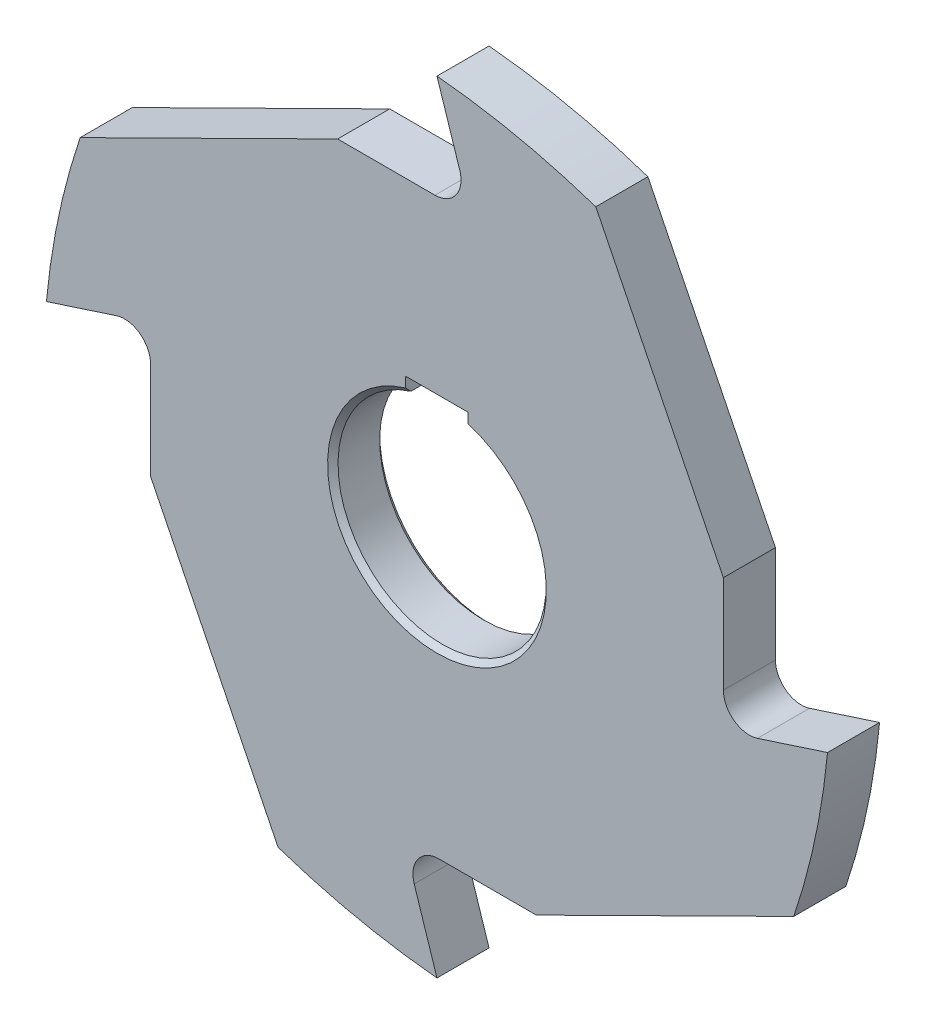
ISO-10303-21;
HEADER;
FILE_DESCRIPTION(('STEP AP214'),'2;1');
FILE_NAME('part.step','',(''),(''),'','','');
FILE_SCHEMA(('AUTOMOTIVE_DESIGN { 1 0 10303 214 1 1 1 1 }'));
ENDSEC;
DATA;
#1=APPLICATION_CONTEXT('core data for automotive mechanical design processes');
#2=APPLICATION_PROTOCOL_DEFINITION('international standard','automotive_design',2000,#1);
#3=PRODUCT_CONTEXT('',#1,'mechanical');
#4=PRODUCT('Part','Part','',(#3));
#5=PRODUCT_RELATED_PRODUCT_CATEGORY('part','',(#4));
#6=PRODUCT_DEFINITION_FORMATION('','',#4);
#7=PRODUCT_DEFINITION_CONTEXT('part definition',#1,'design');
#8=PRODUCT_DEFINITION('design','',#6,#7);
#9=PRODUCT_DEFINITION_SHAPE('','',#8);
#10=(LENGTH_UNIT() NAMED_UNIT(*) SI_UNIT(.MILLI.,.METRE.));
#11=(NAMED_UNIT(*) PLANE_ANGLE_UNIT() SI_UNIT($,.RADIAN.));
#12=(NAMED_UNIT(*) SI_UNIT($,.STERADIAN.) SOLID_ANGLE_UNIT());
#13=UNCERTAINTY_MEASURE_WITH_UNIT(LENGTH_MEASURE(1.E-05),#10,'distance_accuracy_value','');
#14=(GEOMETRIC_REPRESENTATION_CONTEXT(3) GLOBAL_UNCERTAINTY_ASSIGNED_CONTEXT((#13)) GLOBAL_UNIT_ASSIGNED_CONTEXT((#10,
#11,#12)) REPRESENTATION_CONTEXT('',''));
#15=CARTESIAN_POINT('',(0.,0.,0.));
#16=DIRECTION('',(0.,0.,1.));
#17=DIRECTION('',(1.,0.,0.));
#18=AXIS2_PLACEMENT_3D('',#15,#16,#17);
#19=CARTESIAN_POINT('',(0.,0.,-10.));
#20=DIRECTION('',(0.,0.,1.));
#21=DIRECTION('',(1.,0.,0.));
#22=AXIS2_PLACEMENT_3D('',#19,#20,#21);
#23=CYLINDRICAL_SURFACE('',#22,20.);
#24=DIRECTION('',(0.,0.,1.));
#25=VECTOR('',#24,1.);
#26=CARTESIAN_POINT('',(6.,19.0787840283389,-10.));
#27=LINE('',#26,#25);
#28=CARTESIAN_POINT('',(6.,19.0787840283389,-8.99999999999997));
#29=VERTEX_POINT('',#28);
#30=CARTESIAN_POINT('',(6.,19.0787840283389,-1.));
#31=VERTEX_POINT('',#30);
#32=EDGE_CURVE('E352',#29,#31,#27,.T.);
#33=ORIENTED_EDGE('',*,*,#32,.F.);
#34=CARTESIAN_POINT('',(0.,0.,-8.99999999999997));
#35=DIRECTION('',(0.,0.,1.));
#36=DIRECTION('',(1.,0.,0.));
#37=AXIS2_PLACEMENT_3D('',#34,#35,#36);
#38=CIRCLE('',#37,20.);
#39=CARTESIAN_POINT('',(-6.,19.0787840283389,-8.99999999999997));
#40=VERTEX_POINT('',#39);
#41=EDGE_CURVE('E530',#29,#40,#38,.F.);
#42=ORIENTED_EDGE('',*,*,#41,.T.);
#43=DIRECTION('',(0.,0.,1.));
#44=VECTOR('',#43,1.);
#45=CARTESIAN_POINT('',(-6.,19.0787840283389,-10.));
#46=LINE('',#45,#44);
#47=CARTESIAN_POINT('',(-6.,19.0787840283389,-1.));
#48=VERTEX_POINT('',#47);
#49=EDGE_CURVE('E362',#40,#48,#46,.T.);
#50=ORIENTED_EDGE('',*,*,#49,.T.);
#51=CARTESIAN_POINT('',(0.,0.,-1.));
#52=DIRECTION('',(0.,0.,1.));
#53=DIRECTION('',(1.,0.,0.));
#54=AXIS2_PLACEMENT_3D('',#51,#52,#53);
#55=CIRCLE('',#54,20.);
#56=EDGE_CURVE('E532',#48,#31,#55,.T.);
#57=ORIENTED_EDGE('',*,*,#56,.T.);
#58=EDGE_LOOP('',(#33,#42,#50,#57));
#59=FACE_BOUND('',#58,.T.);
#60=ADVANCED_FACE('F36',(#59),#23,.F.);
#61=CARTESIAN_POINT('',(6.,0.,-10.));
#62=DIRECTION('',(1.,0.,0.));
#63=DIRECTION('',(0.,0.,-1.));
#64=AXIS2_PLACEMENT_3D('',#61,#62,#63);
#65=PLANE('',#64);
#66=DIRECTION('',(0.,1.,0.));
#67=VECTOR('',#66,1.);
#68=CARTESIAN_POINT('',(6.,0.,-10.));
#69=LINE('',#68,#67);
#70=CARTESIAN_POINT('',(6.,20.1246117974981,-10.));
#71=VERTEX_POINT('',#70);
#72=CARTESIAN_POINT('',(6.,22.0787840283389,-10.));
#73=VERTEX_POINT('',#72);
#74=EDGE_CURVE('E221',#71,#73,#69,.T.);
#75=ORIENTED_EDGE('',*,*,#74,.F.);
#76=CARTESIAN_POINT('',(6.,20.1246117974981,-10.));
#77=CARTESIAN_POINT('',(6.,19.9504975400754,-9.83313424107121));
#78=CARTESIAN_POINT('',(6.,19.7762880979616,-9.66636802893565));
#79=CARTESIAN_POINT('',(6.,19.4276788415782,-9.33303469559913));
#80=CARTESIAN_POINT('',(6.,19.2532790273057,-9.16646757440136));
#81=CARTESIAN_POINT('',(6.,19.0787840283389,-8.99999999999997));
#82=B_SPLINE_CURVE_WITH_KNOTS('',3,(#76,#77,#78,#79,#80,#81),.UNSPECIFIED.,.F.,.F.,(4,2,4),(0.,
0.723490907396197,1.44698182630379),.UNSPECIFIED.);
#83=EDGE_CURVE('E408',#71,#29,#82,.T.);
#84=ORIENTED_EDGE('',*,*,#83,.T.);
#85=ORIENTED_EDGE('',*,*,#32,.T.);
#86=CARTESIAN_POINT('',(6.,19.0787840283389,-1.));
#87=CARTESIAN_POINT('',(6.,19.2532790273057,-0.83353242559862));
#88=CARTESIAN_POINT('',(6.,19.4276788415782,-0.666965304400848));
#89=CARTESIAN_POINT('',(6.,19.7762880979616,-0.333631971064345));
#90=CARTESIAN_POINT('',(6.,19.9504975400754,-0.166865758928783));
#91=CARTESIAN_POINT('',(6.,20.1246117974981,0.));
#92=B_SPLINE_CURVE_WITH_KNOTS('',3,(#86,#87,#88,#89,#90,#91),.UNSPECIFIED.,.F.,.F.,(4,2,4),(0.,
0.723490918907581,1.44698182630377),.UNSPECIFIED.);
#93=CARTESIAN_POINT('',(6.,20.1246117974981,0.));
#94=VERTEX_POINT('',#93);
#95=EDGE_CURVE('E402',#31,#94,#92,.T.);
#96=ORIENTED_EDGE('',*,*,#95,.T.);
#97=DIRECTION('',(0.,1.,0.));
#98=VECTOR('',#97,1.);
#99=CARTESIAN_POINT('',(6.,0.,0.));
#100=LINE('',#99,#98);
#101=CARTESIAN_POINT('',(6.,22.0787840283389,0.));
#102=VERTEX_POINT('',#101);
#103=EDGE_CURVE('E230',#94,#102,#100,.T.);
#104=ORIENTED_EDGE('',*,*,#103,.T.);
#105=DIRECTION('',(0.,0.,1.));
#106=VECTOR('',#105,1.);
#107=CARTESIAN_POINT('',(6.,22.0787840283389,-10.));
#108=LINE('',#107,#106);
#109=EDGE_CURVE('E356',#73,#102,#108,.T.);
#110=ORIENTED_EDGE('',*,*,#109,.F.);
#111=EDGE_LOOP('',(#75,#84,#85,#96,#104,#110));
#112=FACE_BOUND('',#111,.T.);
#113=ADVANCED_FACE('F413',(#112),#65,.F.);
#114=CARTESIAN_POINT('',(0.,22.0787840283389,-10.));
#115=DIRECTION('',(0.,-1.,0.));
#116=DIRECTION('',(0.,0.,-1.));
#117=AXIS2_PLACEMENT_3D('',#114,#115,#116);
#118=PLANE('',#117);
#119=DIRECTION('',(1.,0.,0.));
#120=VECTOR('',#119,1.);
#121=CARTESIAN_POINT('',(0.,22.0787840283389,0.));
#122=LINE('',#121,#120);
#123=CARTESIAN_POINT('',(-6.,22.0787840283389,0.));
#124=VERTEX_POINT('',#123);
#125=EDGE_CURVE('E348',#124,#102,#122,.T.);
#126=ORIENTED_EDGE('',*,*,#125,.F.);
#127=DIRECTION('',(0.,0.,1.));
#128=VECTOR('',#127,1.);
#129=CARTESIAN_POINT('',(-6.,22.0787840283389,-10.));
#130=LINE('',#129,#128);
#131=CARTESIAN_POINT('',(-6.,22.0787840283389,-10.));
#132=VERTEX_POINT('',#131);
#133=EDGE_CURVE('E359',#132,#124,#130,.T.);
#134=ORIENTED_EDGE('',*,*,#133,.F.);
#135=DIRECTION('',(1.,0.,0.));
#136=VECTOR('',#135,1.);
#137=CARTESIAN_POINT('',(0.,22.0787840283389,-10.));
#138=LINE('',#137,#136);
#139=EDGE_CURVE('E285',#132,#73,#138,.T.);
#140=ORIENTED_EDGE('',*,*,#139,.T.);
#141=ORIENTED_EDGE('',*,*,#109,.T.);
#142=EDGE_LOOP('',(#126,#134,#140,#141));
#143=FACE_BOUND('',#142,.T.);
#144=ADVANCED_FACE('F418',(#143),#118,.T.);
#145=CARTESIAN_POINT('',(-60.,-0.3835156776972,-10.));
#146=DIRECTION('',(0.,0.,1.));
#147=DIRECTION('',(1.,0.,0.));
#148=AXIS2_PLACEMENT_3D('',#145,#146,#147);
#149=CYLINDRICAL_SURFACE('',#148,4.99999999999999);
#150=CARTESIAN_POINT('',(-60.,-0.3835156776972,0.));
#151=DIRECTION('',(0.,0.,1.));
#152=DIRECTION('',(1.,0.,0.));
#153=AXIS2_PLACEMENT_3D('',#150,#151,#152);
#154=CIRCLE('',#153,4.99999999999999);
#155=CARTESIAN_POINT('',(-55.,-0.383515677697252,0.));
#156=VERTEX_POINT('',#155);
#157=CARTESIAN_POINT('',(-61.5450849718746,4.3717669037786,0.));
#158=VERTEX_POINT('',#157);
#159=EDGE_CURVE('E289',#156,#158,#154,.T.);
#160=ORIENTED_EDGE('',*,*,#159,.T.);
#161=DIRECTION('',(0.,0.,1.));
#162=VECTOR('',#161,1.);
#163=CARTESIAN_POINT('',(-61.5450849718746,4.3717669037786,-10.));
#164=LINE('',#163,#162);
#165=CARTESIAN_POINT('',(-61.5450849718746,4.3717669037786,-10.));
#166=VERTEX_POINT('',#165);
#167=EDGE_CURVE('E226',#166,#158,#164,.T.);
#168=ORIENTED_EDGE('',*,*,#167,.F.);
#169=CARTESIAN_POINT('',(-60.,-0.3835156776972,-10.));
#170=DIRECTION('',(0.,0.,1.));
#171=DIRECTION('',(1.,0.,0.));
#172=AXIS2_PLACEMENT_3D('',#169,#170,#171);
#173=CIRCLE('',#172,4.99999999999999);
#174=CARTESIAN_POINT('',(-55.,-0.383515677697252,-10.));
#175=VERTEX_POINT('',#174);
#176=EDGE_CURVE('E224',#175,#166,#173,.T.);
#177=ORIENTED_EDGE('',*,*,#176,.F.);
#178=DIRECTION('',(0.,0.,1.));
#179=VECTOR('',#178,1.);
#180=CARTESIAN_POINT('',(-55.,-0.383515677697252,-10.));
#181=LINE('',#180,#179);
#182=EDGE_CURVE('E210',#175,#156,#181,.T.);
#183=ORIENTED_EDGE('',*,*,#182,.T.);
#184=EDGE_LOOP('',(#160,#168,#177,#183));
#185=FACE_BOUND('',#184,.T.);
#186=ADVANCED_FACE('F225',(#185),#149,.F.);
#187=CARTESIAN_POINT('',(-7.16186271093895,22.0419469609674,-10.));
#188=DIRECTION('',(0.309016994374931,-0.951056516295159,0.));
#189=DIRECTION('',(0.951056516295159,0.309016994374931,0.));
#190=AXIS2_PLACEMENT_3D('',#187,#188,#189);
#191=PLANE('',#190);
#192=DIRECTION('',(0.951056516295159,0.309016994374931,0.));
#193=VECTOR('',#192,1.);
#194=CARTESIAN_POINT('',(-7.16186271093895,22.0419469609674,0.));
#195=LINE('',#194,#193);
#196=CARTESIAN_POINT('',(-75.,7.8756445809347E-13,0.));
#197=VERTEX_POINT('',#196);
#198=EDGE_CURVE('E343',#197,#158,#195,.T.);
#199=ORIENTED_EDGE('',*,*,#198,.F.);
#200=DIRECTION('',(0.,0.,1.));
#201=VECTOR('',#200,1.);
#202=CARTESIAN_POINT('',(-75.,7.8756445809347E-13,-10.));
#203=LINE('',#202,#201);
#204=CARTESIAN_POINT('',(-75.,7.8756445809347E-13,-10.));
#205=VERTEX_POINT('',#204);
#206=EDGE_CURVE('E365',#205,#197,#203,.T.);
#207=ORIENTED_EDGE('',*,*,#206,.F.);
#208=DIRECTION('',(0.951056516295159,0.309016994374931,0.));
#209=VECTOR('',#208,1.);
#210=CARTESIAN_POINT('',(-7.16186271093895,22.0419469609674,-10.));
#211=LINE('',#210,#209);
#212=EDGE_CURVE('E281',#205,#166,#211,.T.);
#213=ORIENTED_EDGE('',*,*,#212,.T.);
#214=ORIENTED_EDGE('',*,*,#167,.T.);
#215=EDGE_LOOP('',(#199,#207,#213,#214));
#216=FACE_BOUND('',#215,.T.);
#217=ADVANCED_FACE('F448',(#216),#191,.T.);
#218=CARTESIAN_POINT('',(59.4081249488118,-12.6275867743834,-10.));
#219=DIRECTION('',(0.,0.,1.));
#220=DIRECTION('',(1.,0.,0.));
#221=AXIS2_PLACEMENT_3D('',#218,#219,#220);
#222=CYLINDRICAL_SURFACE('',#221,135.);
#223=CARTESIAN_POINT('',(59.4081249488118,-12.6275867743834,0.));
#224=DIRECTION('',(0.,0.,1.));
#225=DIRECTION('',(1.,0.,0.));
#226=AXIS2_PLACEMENT_3D('',#223,#224,#225);
#227=CIRCLE('',#226,135.);
#228=CARTESIAN_POINT('',(-68.5159093231945,30.5052482306864,0.));
#229=VERTEX_POINT('',#228);
#230=EDGE_CURVE('E340',#197,#229,#227,.F.);
#231=ORIENTED_EDGE('',*,*,#230,.T.);
#232=DIRECTION('',(0.,0.,1.));
#233=VECTOR('',#232,1.);
#234=CARTESIAN_POINT('',(-68.5159093231945,30.5052482306864,-10.));
#235=LINE('',#234,#233);
#236=CARTESIAN_POINT('',(-68.5159093231945,30.5052482306864,-10.));
#237=VERTEX_POINT('',#236);
#238=EDGE_CURVE('E367',#237,#229,#235,.T.);
#239=ORIENTED_EDGE('',*,*,#238,.F.);
#240=CARTESIAN_POINT('',(59.4081249488118,-12.6275867743834,-10.));
#241=DIRECTION('',(0.,0.,1.));
#242=DIRECTION('',(1.,0.,0.));
#243=AXIS2_PLACEMENT_3D('',#240,#241,#242);
#244=CIRCLE('',#243,135.);
#245=EDGE_CURVE('E279',#205,#237,#244,.F.);
#246=ORIENTED_EDGE('',*,*,#245,.F.);
#247=ORIENTED_EDGE('',*,*,#206,.T.);
#248=EDGE_LOOP('',(#231,#239,#246,#247));
#249=FACE_BOUND('',#248,.T.);
#250=ADVANCED_FACE('F514',(#249),#222,.T.);
#251=CARTESIAN_POINT('',(-25.6402170443291,51.7489882953533,-10.));
#252=DIRECTION('',(-0.443965408465407,0.896043925310665,0.));
#253=DIRECTION('',(-0.896043925310665,-0.443965408465407,0.));
#254=AXIS2_PLACEMENT_3D('',#251,#252,#253);
#255=PLANE('',#254);
#256=DIRECTION('',(-0.896043925310665,-0.443965408465407,0.));
#257=VECTOR('',#256,1.);
#258=CARTESIAN_POINT('',(-25.6402170443291,51.7489882953533,0.));
#259=LINE('',#258,#257);
#260=CARTESIAN_POINT('',(-19.0787840283387,55.,0.));
#261=VERTEX_POINT('',#260);
#262=EDGE_CURVE('E337',#261,#229,#259,.T.);
#263=ORIENTED_EDGE('',*,*,#262,.F.);
#264=DIRECTION('',(0.,0.,1.));
#265=VECTOR('',#264,1.);
#266=CARTESIAN_POINT('',(-19.0787840283387,55.,-10.));
#267=LINE('',#266,#265);
#268=CARTESIAN_POINT('',(-19.0787840283387,55.,-10.));
#269=VERTEX_POINT('',#268);
#270=EDGE_CURVE('E369',#269,#261,#267,.T.);
#271=ORIENTED_EDGE('',*,*,#270,.F.);
#272=DIRECTION('',(-0.896043925310665,-0.443965408465407,0.));
#273=VECTOR('',#272,1.);
#274=CARTESIAN_POINT('',(-25.6402170443291,51.7489882953533,-10.));
#275=LINE('',#274,#273);
#276=EDGE_CURVE('E276',#269,#237,#275,.T.);
#277=ORIENTED_EDGE('',*,*,#276,.T.);
#278=ORIENTED_EDGE('',*,*,#238,.T.);
#279=EDGE_LOOP('',(#263,#271,#277,#278));
#280=FACE_BOUND('',#279,.T.);
#281=ADVANCED_FACE('F510',(#280),#255,.T.);
#282=CARTESIAN_POINT('',(0.,55.,-10.));
#283=DIRECTION('',(0.,1.,0.));
#284=DIRECTION('',(-1.,0.,0.));
#285=AXIS2_PLACEMENT_3D('',#282,#283,#284);
#286=PLANE('',#285);
#287=DIRECTION('',(-1.,0.,0.));
#288=VECTOR('',#287,1.);
#289=CARTESIAN_POINT('',(0.,55.,0.));
#290=LINE('',#289,#288);
#291=CARTESIAN_POINT('',(-0.383515677697828,55.,0.));
#292=VERTEX_POINT('',#291);
#293=EDGE_CURVE('E334',#292,#261,#290,.T.);
#294=ORIENTED_EDGE('',*,*,#293,.F.);
#295=DIRECTION('',(0.,0.,1.));
#296=VECTOR('',#295,1.);
#297=CARTESIAN_POINT('',(-0.383515677697828,55.,-10.));
#298=LINE('',#297,#296);
#299=CARTESIAN_POINT('',(-0.383515677697828,55.,-10.));
#300=VERTEX_POINT('',#299);
#301=EDGE_CURVE('E371',#300,#292,#298,.T.);
#302=ORIENTED_EDGE('',*,*,#301,.F.);
#303=DIRECTION('',(-1.,0.,0.));
#304=VECTOR('',#303,1.);
#305=CARTESIAN_POINT('',(0.,55.,-10.));
#306=LINE('',#305,#304);
#307=EDGE_CURVE('E273',#300,#269,#306,.T.);
#308=ORIENTED_EDGE('',*,*,#307,.T.);
#309=ORIENTED_EDGE('',*,*,#270,.T.);
#310=EDGE_LOOP('',(#294,#302,#308,#309));
#311=FACE_BOUND('',#310,.T.);
#312=ADVANCED_FACE('F506',(#311),#286,.T.);
#313=CARTESIAN_POINT('',(-0.383515677697828,60.,-10.));
#314=DIRECTION('',(0.,0.,1.));
#315=DIRECTION('',(1.,0.,0.));
#316=AXIS2_PLACEMENT_3D('',#313,#314,#315);
#317=CYLINDRICAL_SURFACE('',#316,4.99999999999999);
#318=CARTESIAN_POINT('',(-0.383515677697828,60.,0.));
#319=DIRECTION('',(0.,0.,1.));
#320=DIRECTION('',(1.,0.,0.));
#321=AXIS2_PLACEMENT_3D('',#318,#319,#320);
#322=CIRCLE('',#321,4.99999999999999);
#323=CARTESIAN_POINT('',(4.37176690377795,61.5450849718747,0.));
#324=VERTEX_POINT('',#323);
#325=EDGE_CURVE('E331',#292,#324,#322,.T.);
#326=ORIENTED_EDGE('',*,*,#325,.T.);
#327=DIRECTION('',(0.,0.,1.));
#328=VECTOR('',#327,1.);
#329=CARTESIAN_POINT('',(4.37176690377795,61.5450849718747,-10.));
#330=LINE('',#329,#328);
#331=CARTESIAN_POINT('',(4.37176690377795,61.5450849718747,-10.));
#332=VERTEX_POINT('',#331);
#333=EDGE_CURVE('E373',#332,#324,#330,.T.);
#334=ORIENTED_EDGE('',*,*,#333,.F.);
#335=CARTESIAN_POINT('',(-0.383515677697828,60.,-10.));
#336=DIRECTION('',(0.,0.,1.));
#337=DIRECTION('',(1.,0.,0.));
#338=AXIS2_PLACEMENT_3D('',#335,#336,#337);
#339=CIRCLE('',#338,4.99999999999999);
#340=EDGE_CURVE('E271',#300,#332,#339,.T.);
#341=ORIENTED_EDGE('',*,*,#340,.F.);
#342=ORIENTED_EDGE('',*,*,#301,.T.);
#343=EDGE_LOOP('',(#326,#334,#341,#342));
#344=FACE_BOUND('',#343,.T.);
#345=ADVANCED_FACE('F502',(#344),#317,.F.);
#346=CARTESIAN_POINT('',(22.0419469609674,7.16186271093919,-10.));
#347=DIRECTION('',(-0.951056516295156,-0.309016994374941,0.));
#348=DIRECTION('',(0.309016994374941,-0.951056516295156,0.));
#349=AXIS2_PLACEMENT_3D('',#346,#347,#348);
#350=PLANE('',#349);
#351=DIRECTION('',(0.309016994374941,-0.951056516295156,0.));
#352=VECTOR('',#351,1.);
#353=CARTESIAN_POINT('',(22.0419469609674,7.16186271093919,0.));
#354=LINE('',#353,#352);
#355=CARTESIAN_POINT('',(0.,75.,0.));
#356=VERTEX_POINT('',#355);
#357=EDGE_CURVE('E328',#356,#324,#354,.T.);
#358=ORIENTED_EDGE('',*,*,#357,.F.);
#359=DIRECTION('',(0.,0.,1.));
#360=VECTOR('',#359,1.);
#361=CARTESIAN_POINT('',(0.,75.,-10.));
#362=LINE('',#361,#360);
#363=CARTESIAN_POINT('',(0.,75.,-10.));
#364=VERTEX_POINT('',#363);
#365=EDGE_CURVE('E375',#364,#356,#362,.T.);
#366=ORIENTED_EDGE('',*,*,#365,.F.);
#367=DIRECTION('',(0.309016994374941,-0.951056516295156,0.));
#368=VECTOR('',#367,1.);
#369=CARTESIAN_POINT('',(22.0419469609674,7.16186271093919,-10.));
#370=LINE('',#369,#368);
#371=EDGE_CURVE('E268',#364,#332,#370,.T.);
#372=ORIENTED_EDGE('',*,*,#371,.T.);
#373=ORIENTED_EDGE('',*,*,#333,.T.);
#374=EDGE_LOOP('',(#358,#366,#372,#373));
#375=FACE_BOUND('',#374,.T.);
#376=ADVANCED_FACE('F498',(#375),#350,.T.);
#377=CARTESIAN_POINT('',(-12.6275867743828,-59.4081249488119,-10.));
#378=DIRECTION('',(0.,0.,1.));
#379=DIRECTION('',(1.,0.,0.));
#380=AXIS2_PLACEMENT_3D('',#377,#378,#379);
#381=CYLINDRICAL_SURFACE('',#380,135.);
#382=CARTESIAN_POINT('',(-12.6275867743828,-59.4081249488119,0.));
#383=DIRECTION('',(0.,0.,1.));
#384=DIRECTION('',(1.,0.,0.));
#385=AXIS2_PLACEMENT_3D('',#382,#383,#384);
#386=CIRCLE('',#385,135.);
#387=CARTESIAN_POINT('',(30.5052482306857,68.5159093231948,0.));
#388=VERTEX_POINT('',#387);
#389=EDGE_CURVE('E325',#356,#388,#386,.F.);
#390=ORIENTED_EDGE('',*,*,#389,.T.);
#391=DIRECTION('',(0.,0.,1.));
#392=VECTOR('',#391,1.);
#393=CARTESIAN_POINT('',(30.5052482306857,68.5159093231948,-10.));
#394=LINE('',#393,#392);
#395=CARTESIAN_POINT('',(30.5052482306857,68.5159093231948,-10.));
#396=VERTEX_POINT('',#395);
#397=EDGE_CURVE('E377',#396,#388,#394,.T.);
#398=ORIENTED_EDGE('',*,*,#397,.F.);
#399=CARTESIAN_POINT('',(-12.6275867743828,-59.4081249488119,-10.));
#400=DIRECTION('',(0.,0.,1.));
#401=DIRECTION('',(1.,0.,0.));
#402=AXIS2_PLACEMENT_3D('',#399,#400,#401);
#403=CIRCLE('',#402,135.);
#404=EDGE_CURVE('E266',#364,#396,#403,.F.);
#405=ORIENTED_EDGE('',*,*,#404,.F.);
#406=ORIENTED_EDGE('',*,*,#365,.T.);
#407=EDGE_LOOP('',(#390,#398,#405,#406));
#408=FACE_BOUND('',#407,.T.);
#409=ADVANCED_FACE('F494',(#408),#381,.T.);
#410=CARTESIAN_POINT('',(51.748988295353,25.6402170443297,-10.));
#411=DIRECTION('',(0.89604392531066,0.443965408465416,0.));
#412=DIRECTION('',(-0.443965408465416,0.89604392531066,0.));
#413=AXIS2_PLACEMENT_3D('',#410,#411,#412);
#414=PLANE('',#413);
#415=DIRECTION('',(-0.443965408465416,0.89604392531066,0.));
#416=VECTOR('',#415,1.);
#417=CARTESIAN_POINT('',(51.748988295353,25.6402170443297,0.));
#418=LINE('',#417,#416);
#419=CARTESIAN_POINT('',(55.,19.0787840283389,0.));
#420=VERTEX_POINT('',#419);
#421=EDGE_CURVE('E322',#420,#388,#418,.T.);
#422=ORIENTED_EDGE('',*,*,#421,.F.);
#423=DIRECTION('',(0.,0.,1.));
#424=VECTOR('',#423,1.);
#425=CARTESIAN_POINT('',(55.,19.0787840283389,-10.));
#426=LINE('',#425,#424);
#427=CARTESIAN_POINT('',(55.,19.0787840283389,-10.));
#428=VERTEX_POINT('',#427);
#429=EDGE_CURVE('E379',#428,#420,#426,.T.);
#430=ORIENTED_EDGE('',*,*,#429,.F.);
#431=DIRECTION('',(-0.443965408465416,0.89604392531066,0.));
#432=VECTOR('',#431,1.);
#433=CARTESIAN_POINT('',(51.748988295353,25.6402170443297,-10.));
#434=LINE('',#433,#432);
#435=EDGE_CURVE('E263',#428,#396,#434,.T.);
#436=ORIENTED_EDGE('',*,*,#435,.T.);
#437=ORIENTED_EDGE('',*,*,#397,.T.);
#438=EDGE_LOOP('',(#422,#430,#436,#437));
#439=FACE_BOUND('',#438,.T.);
#440=ADVANCED_FACE('F490',(#439),#414,.T.);
#441=CARTESIAN_POINT('',(55.,0.,-10.));
#442=DIRECTION('',(1.,0.,0.));
#443=DIRECTION('',(0.,1.,0.));
#444=AXIS2_PLACEMENT_3D('',#441,#442,#443);
#445=PLANE('',#444);
#446=DIRECTION('',(0.,1.,0.));
#447=VECTOR('',#446,1.);
#448=CARTESIAN_POINT('',(55.,0.,0.));
#449=LINE('',#448,#447);
#450=CARTESIAN_POINT('',(55.,0.383515677697636,0.));
#451=VERTEX_POINT('',#450);
#452=EDGE_CURVE('E319',#451,#420,#449,.T.);
#453=ORIENTED_EDGE('',*,*,#452,.F.);
#454=DIRECTION('',(0.,0.,1.));
#455=VECTOR('',#454,1.);
#456=CARTESIAN_POINT('',(55.,0.383515677697636,-10.));
#457=LINE('',#456,#455);
#458=CARTESIAN_POINT('',(55.,0.383515677697636,-10.));
#459=VERTEX_POINT('',#458);
#460=EDGE_CURVE('E381',#459,#451,#457,.T.);
#461=ORIENTED_EDGE('',*,*,#460,.F.);
#462=DIRECTION('',(0.,1.,0.));
#463=VECTOR('',#462,1.);
#464=CARTESIAN_POINT('',(55.,0.,-10.));
#465=LINE('',#464,#463);
#466=EDGE_CURVE('E260',#459,#428,#465,.T.);
#467=ORIENTED_EDGE('',*,*,#466,.T.);
#468=ORIENTED_EDGE('',*,*,#429,.T.);
#469=EDGE_LOOP('',(#453,#461,#467,#468));
#470=FACE_BOUND('',#469,.T.);
#471=ADVANCED_FACE('F486',(#470),#445,.T.);
#472=CARTESIAN_POINT('',(60.,0.383515677697619,-10.));
#473=DIRECTION('',(0.,0.,1.));
#474=DIRECTION('',(1.,0.,0.));
#475=AXIS2_PLACEMENT_3D('',#472,#473,#474);
#476=CYLINDRICAL_SURFACE('',#475,5.);
#477=CARTESIAN_POINT('',(60.,0.383515677697619,0.));
#478=DIRECTION('',(0.,0.,1.));
#479=DIRECTION('',(1.,0.,0.));
#480=AXIS2_PLACEMENT_3D('',#477,#478,#479);
#481=CIRCLE('',#480,5.);
#482=CARTESIAN_POINT('',(61.5450849718747,-4.37176690377817,0.));
#483=VERTEX_POINT('',#482);
#484=EDGE_CURVE('E316',#451,#483,#481,.T.);
#485=ORIENTED_EDGE('',*,*,#484,.T.);
#486=DIRECTION('',(0.,0.,1.));
#487=VECTOR('',#486,1.);
#488=CARTESIAN_POINT('',(61.5450849718747,-4.37176690377817,-10.));
#489=LINE('',#488,#487);
#490=CARTESIAN_POINT('',(61.5450849718747,-4.37176690377817,-10.));
#491=VERTEX_POINT('',#490);
#492=EDGE_CURVE('E383',#491,#483,#489,.T.);
#493=ORIENTED_EDGE('',*,*,#492,.F.);
#494=CARTESIAN_POINT('',(60.,0.383515677697619,-10.));
#495=DIRECTION('',(0.,0.,1.));
#496=DIRECTION('',(1.,0.,0.));
#497=AXIS2_PLACEMENT_3D('',#494,#495,#496);
#498=CIRCLE('',#497,5.);
#499=EDGE_CURVE('E258',#459,#491,#498,.T.);
#500=ORIENTED_EDGE('',*,*,#499,.F.);
#501=ORIENTED_EDGE('',*,*,#460,.T.);
#502=EDGE_LOOP('',(#485,#493,#500,#501));
#503=FACE_BOUND('',#502,.T.);
#504=ADVANCED_FACE('F482',(#503),#476,.F.);
#505=CARTESIAN_POINT('',(7.16186271093912,-22.0419469609674,-10.));
#506=DIRECTION('',(-0.309016994374938,0.951056516295157,0.));
#507=DIRECTION('',(-0.951056516295157,-0.309016994374938,0.));
#508=AXIS2_PLACEMENT_3D('',#505,#506,#507);
#509=PLANE('',#508);
#510=DIRECTION('',(-0.951056516295157,-0.309016994374938,0.));
#511=VECTOR('',#510,1.);
#512=CARTESIAN_POINT('',(7.16186271093912,-22.0419469609674,0.));
#513=LINE('',#512,#511);
#514=CARTESIAN_POINT('',(75.,-2.63677968348475E-13,0.));
#515=VERTEX_POINT('',#514);
#516=EDGE_CURVE('E313',#515,#483,#513,.T.);
#517=ORIENTED_EDGE('',*,*,#516,.F.);
#518=DIRECTION('',(0.,0.,1.));
#519=VECTOR('',#518,1.);
#520=CARTESIAN_POINT('',(75.,-2.63677968348475E-13,-10.));
#521=LINE('',#520,#519);
#522=CARTESIAN_POINT('',(75.,-2.63677968348475E-13,-10.));
#523=VERTEX_POINT('',#522);
#524=EDGE_CURVE('E385',#523,#515,#521,.T.);
#525=ORIENTED_EDGE('',*,*,#524,.F.);
#526=DIRECTION('',(-0.951056516295157,-0.309016994374938,0.));
#527=VECTOR('',#526,1.);
#528=CARTESIAN_POINT('',(7.16186271093912,-22.0419469609674,-10.));
#529=LINE('',#528,#527);
#530=EDGE_CURVE('E255',#523,#491,#529,.T.);
#531=ORIENTED_EDGE('',*,*,#530,.T.);
#532=ORIENTED_EDGE('',*,*,#492,.T.);
#533=EDGE_LOOP('',(#517,#525,#531,#532));
#534=FACE_BOUND('',#533,.T.);
#535=ADVANCED_FACE('F478',(#534),#509,.T.);
#536=CARTESIAN_POINT('',(-59.4081249488119,12.627586774383,-10.));
#537=DIRECTION('',(0.,0.,1.));
#538=DIRECTION('',(1.,0.,0.));
#539=AXIS2_PLACEMENT_3D('',#536,#537,#538);
#540=CYLINDRICAL_SURFACE('',#539,135.);
#541=CARTESIAN_POINT('',(-59.4081249488119,12.627586774383,0.));
#542=DIRECTION('',(0.,0.,1.));
#543=DIRECTION('',(1.,0.,0.));
#544=AXIS2_PLACEMENT_3D('',#541,#542,#543);
#545=CIRCLE('',#544,135.);
#546=CARTESIAN_POINT('',(68.5159093231947,-30.5052482306859,0.));
#547=VERTEX_POINT('',#546);
#548=EDGE_CURVE('E310',#515,#547,#545,.F.);
#549=ORIENTED_EDGE('',*,*,#548,.T.);
#550=DIRECTION('',(0.,0.,1.));
#551=VECTOR('',#550,1.);
#552=CARTESIAN_POINT('',(68.5159093231947,-30.5052482306859,-10.));
#553=LINE('',#552,#551);
#554=CARTESIAN_POINT('',(68.5159093231947,-30.5052482306859,-10.));
#555=VERTEX_POINT('',#554);
#556=EDGE_CURVE('E387',#555,#547,#553,.T.);
#557=ORIENTED_EDGE('',*,*,#556,.F.);
#558=CARTESIAN_POINT('',(-59.4081249488119,12.627586774383,-10.));
#559=DIRECTION('',(0.,0.,1.));
#560=DIRECTION('',(1.,0.,0.));
#561=AXIS2_PLACEMENT_3D('',#558,#559,#560);
#562=CIRCLE('',#561,135.);
#563=EDGE_CURVE('E253',#523,#555,#562,.F.);
#564=ORIENTED_EDGE('',*,*,#563,.F.);
#565=ORIENTED_EDGE('',*,*,#524,.T.);
#566=EDGE_LOOP('',(#549,#557,#564,#565));
#567=FACE_BOUND('',#566,.T.);
#568=ADVANCED_FACE('F474',(#567),#540,.T.);
#569=CARTESIAN_POINT('',(25.6402170443295,-51.7489882953531,-10.));
#570=DIRECTION('',(0.443965408465413,-0.896043925310662,0.));
#571=DIRECTION('',(0.896043925310662,0.443965408465413,0.));
#572=AXIS2_PLACEMENT_3D('',#569,#570,#571);
#573=PLANE('',#572);
#574=DIRECTION('',(0.896043925310662,0.443965408465413,0.));
#575=VECTOR('',#574,1.);
#576=CARTESIAN_POINT('',(25.6402170443295,-51.7489882953531,0.));
#577=LINE('',#576,#575);
#578=CARTESIAN_POINT('',(19.0787840283387,-55.0000000000001,0.));
#579=VERTEX_POINT('',#578);
#580=EDGE_CURVE('E307',#579,#547,#577,.T.);
#581=ORIENTED_EDGE('',*,*,#580,.F.);
#582=DIRECTION('',(0.,0.,1.));
#583=VECTOR('',#582,1.);
#584=CARTESIAN_POINT('',(19.0787840283387,-55.0000000000001,-10.));
#585=LINE('',#584,#583);
#586=CARTESIAN_POINT('',(19.0787840283387,-55.0000000000001,-10.));
#587=VERTEX_POINT('',#586);
#588=EDGE_CURVE('E389',#587,#579,#585,.T.);
#589=ORIENTED_EDGE('',*,*,#588,.F.);
#590=DIRECTION('',(0.896043925310662,0.443965408465413,0.));
#591=VECTOR('',#590,1.);
#592=CARTESIAN_POINT('',(25.6402170443295,-51.7489882953531,-10.));
#593=LINE('',#592,#591);
#594=EDGE_CURVE('E250',#587,#555,#593,.T.);
#595=ORIENTED_EDGE('',*,*,#594,.T.);
#596=ORIENTED_EDGE('',*,*,#556,.T.);
#597=EDGE_LOOP('',(#581,#589,#595,#596));
#598=FACE_BOUND('',#597,.T.);
#599=ADVANCED_FACE('F470',(#598),#573,.T.);
#600=CARTESIAN_POINT('',(-1.80029947261431E-13,-55.,-10.));
#601=DIRECTION('',(0.,-1.,0.));
#602=DIRECTION('',(1.,0.,0.));
#603=AXIS2_PLACEMENT_3D('',#600,#601,#602);
#604=PLANE('',#603);
#605=DIRECTION('',(1.,0.,0.));
#606=VECTOR('',#605,1.);
#607=CARTESIAN_POINT('',(-1.80029947261431E-13,-55.,0.));
#608=LINE('',#607,#606);
#609=CARTESIAN_POINT('',(0.383515677697444,-55.,0.));
#610=VERTEX_POINT('',#609);
#611=EDGE_CURVE('E304',#610,#579,#608,.T.);
#612=ORIENTED_EDGE('',*,*,#611,.F.);
#613=DIRECTION('',(0.,0.,1.));
#614=VECTOR('',#613,1.);
#615=CARTESIAN_POINT('',(0.383515677697444,-55.,-10.));
#616=LINE('',#615,#614);
#617=CARTESIAN_POINT('',(0.383515677697444,-55.,-10.));
#618=VERTEX_POINT('',#617);
#619=EDGE_CURVE('E391',#618,#610,#616,.T.);
#620=ORIENTED_EDGE('',*,*,#619,.F.);
#621=DIRECTION('',(1.,0.,0.));
#622=VECTOR('',#621,1.);
#623=CARTESIAN_POINT('',(-1.80029947261431E-13,-55.,-10.));
#624=LINE('',#623,#622);
#625=EDGE_CURVE('E247',#618,#587,#624,.T.);
#626=ORIENTED_EDGE('',*,*,#625,.T.);
#627=ORIENTED_EDGE('',*,*,#588,.T.);
#628=EDGE_LOOP('',(#612,#620,#626,#627));
#629=FACE_BOUND('',#628,.T.);
#630=ADVANCED_FACE('F466',(#629),#604,.T.);
#631=CARTESIAN_POINT('',(0.38351567769741,-60.,-10.));
#632=DIRECTION('',(0.,0.,1.));
#633=DIRECTION('',(1.,0.,0.));
#634=AXIS2_PLACEMENT_3D('',#631,#632,#633);
#635=CYLINDRICAL_SURFACE('',#634,5.);
#636=CARTESIAN_POINT('',(0.38351567769741,-60.,0.));
#637=DIRECTION('',(0.,0.,1.));
#638=DIRECTION('',(1.,0.,0.));
#639=AXIS2_PLACEMENT_3D('',#636,#637,#638);
#640=CIRCLE('',#639,5.);
#641=CARTESIAN_POINT('',(-4.37176690377838,-61.5450849718747,0.));
#642=VERTEX_POINT('',#641);
#643=EDGE_CURVE('E301',#610,#642,#640,.T.);
#644=ORIENTED_EDGE('',*,*,#643,.T.);
#645=DIRECTION('',(0.,0.,1.));
#646=VECTOR('',#645,1.);
#647=CARTESIAN_POINT('',(-4.37176690377838,-61.5450849718747,-10.));
#648=LINE('',#647,#646);
#649=CARTESIAN_POINT('',(-4.37176690377838,-61.5450849718747,-10.));
#650=VERTEX_POINT('',#649);
#651=EDGE_CURVE('E393',#650,#642,#648,.T.);
#652=ORIENTED_EDGE('',*,*,#651,.F.);
#653=CARTESIAN_POINT('',(0.38351567769741,-60.,-10.));
#654=DIRECTION('',(0.,0.,1.));
#655=DIRECTION('',(1.,0.,0.));
#656=AXIS2_PLACEMENT_3D('',#653,#654,#655);
#657=CIRCLE('',#656,5.);
#658=EDGE_CURVE('E245',#618,#650,#657,.T.);
#659=ORIENTED_EDGE('',*,*,#658,.F.);
#660=ORIENTED_EDGE('',*,*,#619,.T.);
#661=EDGE_LOOP('',(#644,#652,#659,#660));
#662=FACE_BOUND('',#661,.T.);
#663=ADVANCED_FACE('F462',(#662),#635,.F.);
#664=CARTESIAN_POINT('',(-22.0419469609674,-7.16186271093904,-10.));
#665=DIRECTION('',(0.951056516295158,0.309016994374935,0.));
#666=DIRECTION('',(-0.309016994374935,0.951056516295158,0.));
#667=AXIS2_PLACEMENT_3D('',#664,#665,#666);
#668=PLANE('',#667);
#669=DIRECTION('',(-0.309016994374935,0.951056516295158,0.));
#670=VECTOR('',#669,1.);
#671=CARTESIAN_POINT('',(-22.0419469609674,-7.16186271093904,0.));
#672=LINE('',#671,#670);
#673=CARTESIAN_POINT('',(-5.20417042793042E-13,-75.,0.));
#674=VERTEX_POINT('',#673);
#675=EDGE_CURVE('E298',#674,#642,#672,.T.);
#676=ORIENTED_EDGE('',*,*,#675,.F.);
#677=DIRECTION('',(0.,0.,1.));
#678=VECTOR('',#677,1.);
#679=CARTESIAN_POINT('',(-5.20417042793042E-13,-75.,-10.));
#680=LINE('',#679,#678);
#681=CARTESIAN_POINT('',(-5.20417042793042E-13,-75.,-10.));
#682=VERTEX_POINT('',#681);
#683=EDGE_CURVE('E395',#682,#674,#680,.T.);
#684=ORIENTED_EDGE('',*,*,#683,.F.);
#685=DIRECTION('',(-0.309016994374935,0.951056516295158,0.));
#686=VECTOR('',#685,1.);
#687=CARTESIAN_POINT('',(-22.0419469609674,-7.16186271093904,-10.));
#688=LINE('',#687,#686);
#689=EDGE_CURVE('E242',#682,#650,#688,.T.);
#690=ORIENTED_EDGE('',*,*,#689,.T.);
#691=ORIENTED_EDGE('',*,*,#651,.T.);
#692=EDGE_LOOP('',(#676,#684,#690,#691));
#693=FACE_BOUND('',#692,.T.);
#694=ADVANCED_FACE('F458',(#693),#668,.T.);
#695=CARTESIAN_POINT('',(12.6275867743832,59.4081249488118,-10.));
#696=DIRECTION('',(0.,0.,1.));
#697=DIRECTION('',(1.,0.,0.));
#698=AXIS2_PLACEMENT_3D('',#695,#696,#697);
#699=CYLINDRICAL_SURFACE('',#698,135.);
#700=CARTESIAN_POINT('',(12.6275867743832,59.4081249488118,0.));
#701=DIRECTION('',(0.,0.,1.));
#702=DIRECTION('',(1.,0.,0.));
#703=AXIS2_PLACEMENT_3D('',#700,#701,#702);
#704=CIRCLE('',#703,135.);
#705=CARTESIAN_POINT('',(-30.5052482306862,-68.5159093231946,0.));
#706=VERTEX_POINT('',#705);
#707=EDGE_CURVE('E295',#674,#706,#704,.F.);
#708=ORIENTED_EDGE('',*,*,#707,.T.);
#709=DIRECTION('',(0.,0.,1.));
#710=VECTOR('',#709,1.);
#711=CARTESIAN_POINT('',(-30.5052482306862,-68.5159093231946,-10.));
#712=LINE('',#711,#710);
#713=CARTESIAN_POINT('',(-30.5052482306862,-68.5159093231946,-10.));
#714=VERTEX_POINT('',#713);
#715=EDGE_CURVE('E397',#714,#706,#712,.T.);
#716=ORIENTED_EDGE('',*,*,#715,.F.);
#717=CARTESIAN_POINT('',(12.6275867743832,59.4081249488118,-10.));
#718=DIRECTION('',(0.,0.,1.));
#719=DIRECTION('',(1.,0.,0.));
#720=AXIS2_PLACEMENT_3D('',#717,#718,#719);
#721=CIRCLE('',#720,135.);
#722=EDGE_CURVE('E238',#682,#714,#721,.F.);
#723=ORIENTED_EDGE('',*,*,#722,.F.);
#724=ORIENTED_EDGE('',*,*,#683,.T.);
#725=EDGE_LOOP('',(#708,#716,#723,#724));
#726=FACE_BOUND('',#725,.T.);
#727=ADVANCED_FACE('F454',(#726),#699,.T.);
#728=CARTESIAN_POINT('',(-51.7489882953532,-25.6402170443293,-10.));
#729=DIRECTION('',(-0.896043925310663,-0.44396540846541,0.));
#730=DIRECTION('',(0.44396540846541,-0.896043925310663,0.));
#731=AXIS2_PLACEMENT_3D('',#728,#729,#730);
#732=PLANE('',#731);
#733=DIRECTION('',(0.44396540846541,-0.896043925310663,0.));
#734=VECTOR('',#733,1.);
#735=CARTESIAN_POINT('',(-51.7489882953532,-25.6402170443293,0.));
#736=LINE('',#735,#734);
#737=CARTESIAN_POINT('',(-55.0000000000001,-19.0787840283385,0.));
#738=VERTEX_POINT('',#737);
#739=EDGE_CURVE('E292',#738,#706,#736,.T.);
#740=ORIENTED_EDGE('',*,*,#739,.F.);
#741=DIRECTION('',(0.,0.,1.));
#742=VECTOR('',#741,1.);
#743=CARTESIAN_POINT('',(-55.0000000000001,-19.0787840283385,-10.));
#744=LINE('',#743,#742);
#745=CARTESIAN_POINT('',(-55.0000000000001,-19.0787840283385,-10.));
#746=VERTEX_POINT('',#745);
#747=EDGE_CURVE('E220',#746,#738,#744,.T.);
#748=ORIENTED_EDGE('',*,*,#747,.F.);
#749=DIRECTION('',(0.44396540846541,-0.896043925310663,0.));
#750=VECTOR('',#749,1.);
#751=CARTESIAN_POINT('',(-51.7489882953532,-25.6402170443293,-10.));
#752=LINE('',#751,#750);
#753=EDGE_CURVE('E236',#746,#714,#752,.T.);
#754=ORIENTED_EDGE('',*,*,#753,.T.);
#755=ORIENTED_EDGE('',*,*,#715,.T.);
#756=EDGE_LOOP('',(#740,#748,#754,#755));
#757=FACE_BOUND('',#756,.T.);
#758=ADVANCED_FACE('F451',(#757),#732,.T.);
#759=CARTESIAN_POINT('',(-55.,3.60059894522868E-13,-10.));
#760=DIRECTION('',(-1.,0.,0.));
#761=DIRECTION('',(0.,-1.,0.));
#762=AXIS2_PLACEMENT_3D('',#759,#760,#761);
#763=PLANE('',#762);
#764=DIRECTION('',(0.,-1.,0.));
#765=VECTOR('',#764,1.);
#766=CARTESIAN_POINT('',(-55.,3.60059894522868E-13,0.));
#767=LINE('',#766,#765);
#768=EDGE_CURVE('E216',#156,#738,#767,.T.);
#769=ORIENTED_EDGE('',*,*,#768,.F.);
#770=ORIENTED_EDGE('',*,*,#182,.F.);
#771=DIRECTION('',(0.,-1.,0.));
#772=VECTOR('',#771,1.);
#773=CARTESIAN_POINT('',(-55.,3.60059894522868E-13,-10.));
#774=LINE('',#773,#772);
#775=EDGE_CURVE('E214',#175,#746,#774,.T.);
#776=ORIENTED_EDGE('',*,*,#775,.T.);
#777=ORIENTED_EDGE('',*,*,#747,.T.);
#778=EDGE_LOOP('',(#769,#770,#776,#777));
#779=FACE_BOUND('',#778,.T.);
#780=ADVANCED_FACE('F212',(#779),#763,.T.);
#781=CARTESIAN_POINT('',(-6.,0.,-10.));
#782=DIRECTION('',(1.,0.,0.));
#783=DIRECTION('',(0.,0.,-1.));
#784=AXIS2_PLACEMENT_3D('',#781,#782,#783);
#785=PLANE('',#784);
#786=ORIENTED_EDGE('',*,*,#49,.F.);
#787=CARTESIAN_POINT('',(-6.,19.0787840283389,-8.99999999999997));
#788=CARTESIAN_POINT('',(-6.,19.2532790273057,-9.16646757440136));
#789=CARTESIAN_POINT('',(-6.,19.4276788415782,-9.33303469559913));
#790=CARTESIAN_POINT('',(-6.,19.7762880979616,-9.66636802893565));
#791=CARTESIAN_POINT('',(-6.,19.9504975400754,-9.83313424107121));
#792=CARTESIAN_POINT('',(-6.,20.1246117974981,-10.));
#793=B_SPLINE_CURVE_WITH_KNOTS('',3,(#787,#788,#789,#790,#791,#792),.UNSPECIFIED.,.F.,.F.,(4,2,
4),(0.,0.723490918907591,1.44698182630379),.UNSPECIFIED.);
#794=CARTESIAN_POINT('',(-6.,20.1246117974981,-10.));
#795=VERTEX_POINT('',#794);
#796=EDGE_CURVE('E45',#40,#795,#793,.T.);
#797=ORIENTED_EDGE('',*,*,#796,.T.);
#798=DIRECTION('',(0.,1.,0.));
#799=VECTOR('',#798,1.);
#800=CARTESIAN_POINT('',(-6.,0.,-10.));
#801=LINE('',#800,#799);
#802=EDGE_CURVE('E283',#795,#132,#801,.T.);
#803=ORIENTED_EDGE('',*,*,#802,.T.);
#804=ORIENTED_EDGE('',*,*,#133,.T.);
#805=DIRECTION('',(0.,1.,0.));
#806=VECTOR('',#805,1.);
#807=CARTESIAN_POINT('',(-6.,0.,0.));
#808=LINE('',#807,#806);
#809=CARTESIAN_POINT('',(-6.,20.1246117974981,0.));
#810=VERTEX_POINT('',#809);
#811=EDGE_CURVE('E346',#810,#124,#808,.T.);
#812=ORIENTED_EDGE('',*,*,#811,.F.);
#813=CARTESIAN_POINT('',(-6.,20.1246117974981,0.));
#814=CARTESIAN_POINT('',(-6.,19.9504975400754,-0.166865758928782));
#815=CARTESIAN_POINT('',(-6.,19.7762880979616,-0.333631971064345));
#816=CARTESIAN_POINT('',(-6.,19.4276788415782,-0.666965304400848));
#817=CARTESIAN_POINT('',(-6.,19.2532790273057,-0.833532425598621));
#818=CARTESIAN_POINT('',(-6.,19.0787840283389,-1.00000000000001));
#819=B_SPLINE_CURVE_WITH_KNOTS('',3,(#813,#814,#815,#816,#817,#818),.UNSPECIFIED.,.F.,.F.,(4,2,
4),(0.,0.723490907396188,1.44698182630377),.UNSPECIFIED.);
#820=EDGE_CURVE('E57',#810,#48,#819,.T.);
#821=ORIENTED_EDGE('',*,*,#820,.T.);
#822=EDGE_LOOP('',(#786,#797,#803,#804,#812,#821));
#823=FACE_BOUND('',#822,.T.);
#824=ADVANCED_FACE('F426',(#823),#785,.T.);
#825=CARTESIAN_POINT('',(0.,0.,-10.));
#826=DIRECTION('',(0.,0.,1.));
#827=DIRECTION('',(1.,0.,0.));
#828=AXIS2_PLACEMENT_3D('',#825,#826,#827);
#829=PLANE('',#828);
#830=ORIENTED_EDGE('',*,*,#176,.T.);
#831=ORIENTED_EDGE('',*,*,#212,.F.);
#832=ORIENTED_EDGE('',*,*,#245,.T.);
#833=ORIENTED_EDGE('',*,*,#276,.F.);
#834=ORIENTED_EDGE('',*,*,#307,.F.);
#835=ORIENTED_EDGE('',*,*,#340,.T.);
#836=ORIENTED_EDGE('',*,*,#371,.F.);
#837=ORIENTED_EDGE('',*,*,#404,.T.);
#838=ORIENTED_EDGE('',*,*,#435,.F.);
#839=ORIENTED_EDGE('',*,*,#466,.F.);
#840=ORIENTED_EDGE('',*,*,#499,.T.);
#841=ORIENTED_EDGE('',*,*,#530,.F.);
#842=ORIENTED_EDGE('',*,*,#563,.T.);
#843=ORIENTED_EDGE('',*,*,#594,.F.);
#844=ORIENTED_EDGE('',*,*,#625,.F.);
#845=ORIENTED_EDGE('',*,*,#658,.T.);
#846=ORIENTED_EDGE('',*,*,#689,.F.);
#847=ORIENTED_EDGE('',*,*,#722,.T.);
#848=ORIENTED_EDGE('',*,*,#753,.F.);
#849=ORIENTED_EDGE('',*,*,#775,.F.);
#850=EDGE_LOOP('',(#830,#831,#832,#833,#834,#835,#836,#837,#838,#839,#840,#841,#842,#843,#844,
#845,#846,#847,#848,#849));
#851=FACE_BOUND('',#850,.T.);
#852=ORIENTED_EDGE('',*,*,#802,.F.);
#853=CARTESIAN_POINT('',(0.,0.,-10.));
#854=DIRECTION('',(0.,0.,1.));
#855=DIRECTION('',(1.,0.,0.));
#856=AXIS2_PLACEMENT_3D('',#853,#854,#855);
#857=CIRCLE('',#856,21.);
#858=EDGE_CURVE('E355',#795,#71,#857,.T.);
#859=ORIENTED_EDGE('',*,*,#858,.T.);
#860=ORIENTED_EDGE('',*,*,#74,.T.);
#861=ORIENTED_EDGE('',*,*,#139,.F.);
#862=EDGE_LOOP('',(#852,#859,#860,#861));
#863=FACE_BOUND('',#862,.T.);
#864=ADVANCED_FACE('F233',(#851,#863),#829,.F.);
#865=CARTESIAN_POINT('',(0.,0.,0.));
#866=DIRECTION('',(0.,0.,1.));
#867=DIRECTION('',(1.,0.,0.));
#868=AXIS2_PLACEMENT_3D('',#865,#866,#867);
#869=PLANE('',#868);
#870=ORIENTED_EDGE('',*,*,#159,.F.);
#871=ORIENTED_EDGE('',*,*,#768,.T.);
#872=ORIENTED_EDGE('',*,*,#739,.T.);
#873=ORIENTED_EDGE('',*,*,#707,.F.);
#874=ORIENTED_EDGE('',*,*,#675,.T.);
#875=ORIENTED_EDGE('',*,*,#643,.F.);
#876=ORIENTED_EDGE('',*,*,#611,.T.);
#877=ORIENTED_EDGE('',*,*,#580,.T.);
#878=ORIENTED_EDGE('',*,*,#548,.F.);
#879=ORIENTED_EDGE('',*,*,#516,.T.);
#880=ORIENTED_EDGE('',*,*,#484,.F.);
#881=ORIENTED_EDGE('',*,*,#452,.T.);
#882=ORIENTED_EDGE('',*,*,#421,.T.);
#883=ORIENTED_EDGE('',*,*,#389,.F.);
#884=ORIENTED_EDGE('',*,*,#357,.T.);
#885=ORIENTED_EDGE('',*,*,#325,.F.);
#886=ORIENTED_EDGE('',*,*,#293,.T.);
#887=ORIENTED_EDGE('',*,*,#262,.T.);
#888=ORIENTED_EDGE('',*,*,#230,.F.);
#889=ORIENTED_EDGE('',*,*,#198,.T.);
#890=EDGE_LOOP('',(#870,#871,#872,#873,#874,#875,#876,#877,#878,#879,#880,#881,#882,#883,#884,
#885,#886,#887,#888,#889));
#891=FACE_BOUND('',#890,.T.);
#892=ORIENTED_EDGE('',*,*,#103,.F.);
#893=CARTESIAN_POINT('',(0.,0.,0.));
#894=DIRECTION('',(0.,0.,1.));
#895=DIRECTION('',(1.,0.,0.));
#896=AXIS2_PLACEMENT_3D('',#893,#894,#895);
#897=CIRCLE('',#896,21.);
#898=EDGE_CURVE('E11',#94,#810,#897,.F.);
#899=ORIENTED_EDGE('',*,*,#898,.T.);
#900=ORIENTED_EDGE('',*,*,#811,.T.);
#901=ORIENTED_EDGE('',*,*,#125,.T.);
#902=EDGE_LOOP('',(#892,#899,#900,#901));
#903=FACE_BOUND('',#902,.T.);
#904=ADVANCED_FACE('F420',(#891,#903),#869,.T.);
#905=CARTESIAN_POINT('',(0.,0.,-10.));
#906=DIRECTION('',(0.,0.,-1.));
#907=DIRECTION('',(-1.,0.,0.));
#908=AXIS2_PLACEMENT_3D('',#905,#906,#907);
#909=CONICAL_SURFACE('',#908,21.,0.785398163397441);
#910=ORIENTED_EDGE('',*,*,#796,.F.);
#911=ORIENTED_EDGE('',*,*,#41,.F.);
#912=ORIENTED_EDGE('',*,*,#83,.F.);
#913=ORIENTED_EDGE('',*,*,#858,.F.);
#914=EDGE_LOOP('',(#910,#911,#912,#913));
#915=FACE_BOUND('',#914,.T.);
#916=ADVANCED_FACE('F440',(#915),#909,.F.);
#917=CARTESIAN_POINT('',(0.,0.,-1.));
#918=DIRECTION('',(0.,0.,1.));
#919=DIRECTION('',(1.,0.,0.));
#920=AXIS2_PLACEMENT_3D('',#917,#918,#919);
#921=CONICAL_SURFACE('',#920,20.,0.785398163397455);
#922=ORIENTED_EDGE('',*,*,#820,.F.);
#923=ORIENTED_EDGE('',*,*,#898,.F.);
#924=ORIENTED_EDGE('',*,*,#95,.F.);
#925=ORIENTED_EDGE('',*,*,#56,.F.);
#926=EDGE_LOOP('',(#922,#923,#924,#925));
#927=FACE_BOUND('',#926,.T.);
#928=ADVANCED_FACE('F38',(#927),#921,.F.);
#929=CLOSED_SHELL('',(#60,#113,#144,#186,#217,#250,#281,#312,#345,#376,#409,#440,#471,#504,#535,
#568,#599,#630,#663,#694,#727,#758,#780,#824,#864,#904,#916,#928));
#930=MANIFOLD_SOLID_BREP('B2',#929);
#931=ADVANCED_BREP_SHAPE_REPRESENTATION('',(#18,#930),#14);
#932=SHAPE_DEFINITION_REPRESENTATION(#9,#931);
ENDSEC;
END-ISO-10303-21;
